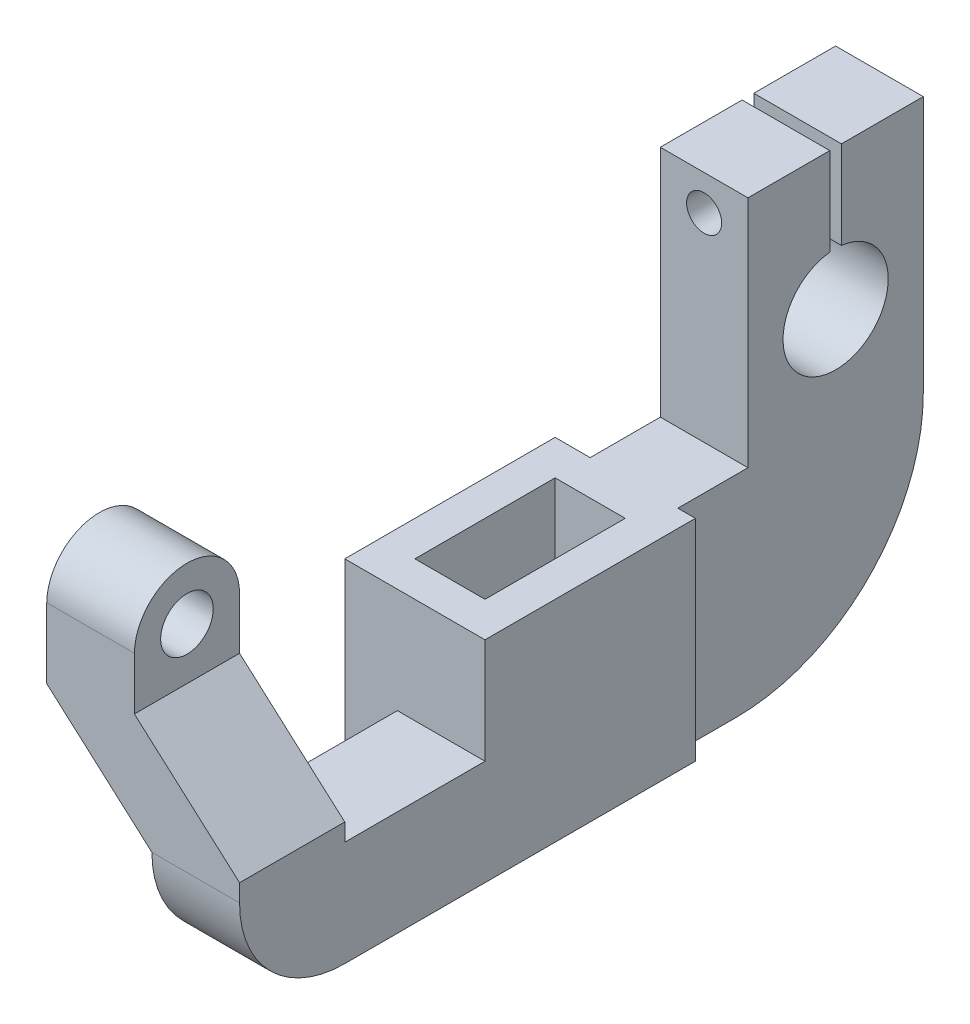
ISO-10303-21;
HEADER;
FILE_DESCRIPTION(('STEP AP214'),'2;1');
FILE_NAME('part.step','',(''),(''),'','','');
FILE_SCHEMA(('AUTOMOTIVE_DESIGN { 1 0 10303 214 1 1 1 1 }'));
ENDSEC;
DATA;
#1=APPLICATION_CONTEXT('core data for automotive mechanical design processes');
#2=APPLICATION_PROTOCOL_DEFINITION('international standard','automotive_design',2000,#1);
#3=PRODUCT_CONTEXT('',#1,'mechanical');
#4=PRODUCT('Part','Part','',(#3));
#5=PRODUCT_RELATED_PRODUCT_CATEGORY('part','',(#4));
#6=PRODUCT_DEFINITION_FORMATION('','',#4);
#7=PRODUCT_DEFINITION_CONTEXT('part definition',#1,'design');
#8=PRODUCT_DEFINITION('design','',#6,#7);
#9=PRODUCT_DEFINITION_SHAPE('','',#8);
#10=(LENGTH_UNIT() NAMED_UNIT(*) SI_UNIT(.MILLI.,.METRE.));
#11=(NAMED_UNIT(*) PLANE_ANGLE_UNIT() SI_UNIT($,.RADIAN.));
#12=(NAMED_UNIT(*) SI_UNIT($,.STERADIAN.) SOLID_ANGLE_UNIT());
#13=UNCERTAINTY_MEASURE_WITH_UNIT(LENGTH_MEASURE(1.E-05),#10,'distance_accuracy_value','');
#14=(GEOMETRIC_REPRESENTATION_CONTEXT(3) GLOBAL_UNCERTAINTY_ASSIGNED_CONTEXT((#13)) GLOBAL_UNIT_ASSIGNED_CONTEXT((#10,
#11,#12)) REPRESENTATION_CONTEXT('',''));
#15=CARTESIAN_POINT('',(0.,0.,0.));
#16=DIRECTION('',(0.,0.,1.));
#17=DIRECTION('',(1.,0.,0.));
#18=AXIS2_PLACEMENT_3D('',#15,#16,#17);
#19=CARTESIAN_POINT('',(-33.,-30.1388436180788,81.));
#20=DIRECTION('',(1.,0.,0.));
#21=DIRECTION('',(0.,0.,-1.));
#22=AXIS2_PLACEMENT_3D('',#19,#20,#21);
#23=CYLINDRICAL_SURFACE('',#22,9.00107091130168);
#24=DIRECTION('',(1.,0.,0.));
#25=VECTOR('',#24,1.);
#26=CARTESIAN_POINT('',(-33.,-30.,90.));
#27=LINE('',#26,#25);
#28=CARTESIAN_POINT('',(-33.,-30.,90.));
#29=VERTEX_POINT('',#28);
#30=CARTESIAN_POINT('',(-18.,-30.0000000000014,90.));
#31=VERTEX_POINT('',#30);
#32=EDGE_CURVE('E432',#29,#31,#27,.T.);
#33=ORIENTED_EDGE('',*,*,#32,.T.);
#34=CARTESIAN_POINT('',(-18.,-30.1388436180788,81.));
#35=DIRECTION('',(1.,0.,0.));
#36=DIRECTION('',(0.,0.,-1.));
#37=AXIS2_PLACEMENT_3D('',#34,#35,#36);
#38=CIRCLE('',#37,9.00107091130168);
#39=CARTESIAN_POINT('',(-18.,-30.,72.));
#40=VERTEX_POINT('',#39);
#41=EDGE_CURVE('E237',#31,#40,#38,.F.);
#42=ORIENTED_EDGE('',*,*,#41,.T.);
#43=DIRECTION('',(1.,0.,0.));
#44=VECTOR('',#43,1.);
#45=CARTESIAN_POINT('',(-33.,-30.,72.));
#46=LINE('',#45,#44);
#47=CARTESIAN_POINT('',(-33.,-30.,72.));
#48=VERTEX_POINT('',#47);
#49=EDGE_CURVE('E434',#48,#40,#46,.T.);
#50=ORIENTED_EDGE('',*,*,#49,.F.);
#51=CARTESIAN_POINT('',(-33.,-30.1388436180788,81.));
#52=DIRECTION('',(1.,0.,0.));
#53=DIRECTION('',(0.,0.,-1.));
#54=AXIS2_PLACEMENT_3D('',#51,#52,#53);
#55=CIRCLE('',#54,9.00107091130168);
#56=EDGE_CURVE('E391',#48,#29,#55,.T.);
#57=ORIENTED_EDGE('',*,*,#56,.T.);
#58=EDGE_LOOP('',(#33,#42,#50,#57));
#59=FACE_BOUND('',#58,.T.);
#60=ADVANCED_FACE('F39',(#59),#23,.T.);
#61=CARTESIAN_POINT('',(-33.,-30.1388436180788,81.));
#62=DIRECTION('',(1.,0.,0.));
#63=DIRECTION('',(0.,0.,-1.));
#64=AXIS2_PLACEMENT_3D('',#61,#62,#63);
#65=CYLINDRICAL_SURFACE('',#64,4.5);
#66=CARTESIAN_POINT('',(-33.,-30.1388436180788,81.));
#67=DIRECTION('',(1.,0.,0.));
#68=DIRECTION('',(0.,0.,-1.));
#69=AXIS2_PLACEMENT_3D('',#66,#67,#68);
#70=CIRCLE('',#69,4.5);
#71=CARTESIAN_POINT('',(-33.,-30.1388436180788,76.5));
#72=VERTEX_POINT('',#71);
#73=EDGE_CURVE('E373',#72,#72,#70,.T.);
#74=ORIENTED_EDGE('',*,*,#73,.F.);
#75=EDGE_LOOP('',(#74));
#76=FACE_BOUND('',#75,.T.);
#77=CARTESIAN_POINT('',(-18.,-30.1388436180788,81.));
#78=DIRECTION('',(1.,0.,0.));
#79=DIRECTION('',(0.,0.,-1.));
#80=AXIS2_PLACEMENT_3D('',#77,#78,#79);
#81=CIRCLE('',#80,4.5);
#82=CARTESIAN_POINT('',(-18.,-30.1388436180788,76.5));
#83=VERTEX_POINT('',#82);
#84=EDGE_CURVE('E43',#83,#83,#81,.F.);
#85=ORIENTED_EDGE('',*,*,#84,.F.);
#86=EDGE_LOOP('',(#85));
#87=FACE_BOUND('',#86,.T.);
#88=ADVANCED_FACE('F556',(#76,#87),#65,.F.);
#89=CARTESIAN_POINT('',(-33.,-58.,72.));
#90=DIRECTION('',(1.,0.,0.));
#91=DIRECTION('',(0.,0.,-1.));
#92=AXIS2_PLACEMENT_3D('',#89,#90,#91);
#93=CYLINDRICAL_SURFACE('',#92,18.);
#94=DIRECTION('',(1.,0.,0.));
#95=VECTOR('',#94,1.);
#96=CARTESIAN_POINT('',(-33.,-58.,90.));
#97=LINE('',#96,#95);
#98=CARTESIAN_POINT('',(-15.,-58.,90.));
#99=VERTEX_POINT('',#98);
#100=CARTESIAN_POINT('',(0.,-58.,90.));
#101=VERTEX_POINT('',#100);
#102=EDGE_CURVE('E430',#99,#101,#97,.T.);
#103=ORIENTED_EDGE('',*,*,#102,.F.);
#104=CARTESIAN_POINT('',(-15.,-58.,72.));
#105=DIRECTION('',(-1.,0.,0.));
#106=DIRECTION('',(0.,-1.,0.));
#107=AXIS2_PLACEMENT_3D('',#104,#105,#106);
#108=CIRCLE('',#107,18.);
#109=CARTESIAN_POINT('',(-15.,-76.,72.));
#110=VERTEX_POINT('',#109);
#111=EDGE_CURVE('E260',#99,#110,#108,.F.);
#112=ORIENTED_EDGE('',*,*,#111,.T.);
#113=DIRECTION('',(1.,0.,0.));
#114=VECTOR('',#113,1.);
#115=CARTESIAN_POINT('',(-33.,-76.,72.));
#116=LINE('',#115,#114);
#117=CARTESIAN_POINT('',(0.,-76.,72.));
#118=VERTEX_POINT('',#117);
#119=EDGE_CURVE('E427',#110,#118,#116,.T.);
#120=ORIENTED_EDGE('',*,*,#119,.T.);
#121=CARTESIAN_POINT('',(0.,-58.,72.));
#122=DIRECTION('',(1.,0.,0.));
#123=DIRECTION('',(0.,0.,-1.));
#124=AXIS2_PLACEMENT_3D('',#121,#122,#123);
#125=CIRCLE('',#124,18.);
#126=EDGE_CURVE('E410',#101,#118,#125,.T.);
#127=ORIENTED_EDGE('',*,*,#126,.F.);
#128=EDGE_LOOP('',(#103,#112,#120,#127));
#129=FACE_BOUND('',#128,.T.);
#130=ADVANCED_FACE('F518',(#129),#93,.T.);
#131=CARTESIAN_POINT('',(-33.,-30.,90.));
#132=DIRECTION('',(0.,0.,1.));
#133=DIRECTION('',(1.,0.,0.));
#134=AXIS2_PLACEMENT_3D('',#131,#132,#133);
#135=PLANE('',#134);
#136=DIRECTION('',(0.74740931868366,-0.66436383882992,0.));
#137=VECTOR('',#136,1.);
#138=CARTESIAN_POINT('',(-27.3103448275862,-30.7241379310345,90.));
#139=LINE('',#138,#137);
#140=CARTESIAN_POINT('',(-18.,-39.,90.));
#141=VERTEX_POINT('',#140);
#142=CARTESIAN_POINT('',(0.,-55.,90.));
#143=VERTEX_POINT('',#142);
#144=EDGE_CURVE('E55',#141,#143,#139,.T.);
#145=ORIENTED_EDGE('',*,*,#144,.F.);
#146=DIRECTION('',(0.,1.,0.));
#147=VECTOR('',#146,1.);
#148=CARTESIAN_POINT('',(-18.,0.,90.));
#149=LINE('',#148,#147);
#150=EDGE_CURVE('E233',#141,#31,#149,.T.);
#151=ORIENTED_EDGE('',*,*,#150,.T.);
#152=ORIENTED_EDGE('',*,*,#32,.F.);
#153=DIRECTION('',(0.,-1.,0.));
#154=VECTOR('',#153,1.);
#155=CARTESIAN_POINT('',(-33.,-30.,90.));
#156=LINE('',#155,#154);
#157=CARTESIAN_POINT('',(-33.,-42.,90.));
#158=VERTEX_POINT('',#157);
#159=EDGE_CURVE('E395',#29,#158,#156,.T.);
#160=ORIENTED_EDGE('',*,*,#159,.T.);
#161=DIRECTION('',(0.74740931868366,-0.66436383882992,0.));
#162=VECTOR('',#161,1.);
#163=CARTESIAN_POINT('',(-35.4206896551724,-39.848275862069,90.));
#164=LINE('',#163,#162);
#165=EDGE_CURVE('E63',#158,#99,#164,.T.);
#166=ORIENTED_EDGE('',*,*,#165,.T.);
#167=ORIENTED_EDGE('',*,*,#102,.T.);
#168=DIRECTION('',(0.,-1.,0.));
#169=VECTOR('',#168,1.);
#170=CARTESIAN_POINT('',(0.,-30.,90.));
#171=LINE('',#170,#169);
#172=EDGE_CURVE('E244',#143,#101,#171,.T.);
#173=ORIENTED_EDGE('',*,*,#172,.F.);
#174=EDGE_LOOP('',(#145,#151,#152,#160,#166,#167,#173));
#175=FACE_BOUND('',#174,.T.);
#176=ADVANCED_FACE('F242',(#175),#135,.T.);
#177=CARTESIAN_POINT('',(-33.,-58.,72.));
#178=DIRECTION('',(0.,0.,-1.));
#179=DIRECTION('',(-1.,0.,0.));
#180=AXIS2_PLACEMENT_3D('',#177,#178,#179);
#181=PLANE('',#180);
#182=DIRECTION('',(-0.74740931868366,0.664363838829919,0.));
#183=VECTOR('',#182,1.);
#184=CARTESIAN_POINT('',(-16.9448275862069,-39.9379310344828,72.));
#185=LINE('',#184,#183);
#186=CARTESIAN_POINT('',(0.,-55.,72.));
#187=VERTEX_POINT('',#186);
#188=CARTESIAN_POINT('',(-18.,-39.,72.));
#189=VERTEX_POINT('',#188);
#190=EDGE_CURVE('E227',#187,#189,#185,.T.);
#191=ORIENTED_EDGE('',*,*,#190,.F.);
#192=DIRECTION('',(0.,1.,0.));
#193=VECTOR('',#192,1.);
#194=CARTESIAN_POINT('',(0.,-58.,72.));
#195=LINE('',#194,#193);
#196=CARTESIAN_POINT('',(0.,-58.,72.));
#197=VERTEX_POINT('',#196);
#198=EDGE_CURVE('E406',#197,#187,#195,.T.);
#199=ORIENTED_EDGE('',*,*,#198,.F.);
#200=DIRECTION('',(1.,0.,0.));
#201=VECTOR('',#200,1.);
#202=CARTESIAN_POINT('',(-33.,-58.,72.));
#203=LINE('',#202,#201);
#204=CARTESIAN_POINT('',(-15.,-58.,72.));
#205=VERTEX_POINT('',#204);
#206=EDGE_CURVE('E437',#205,#197,#203,.T.);
#207=ORIENTED_EDGE('',*,*,#206,.F.);
#208=DIRECTION('',(-0.74740931868366,0.66436383882992,0.));
#209=VECTOR('',#208,1.);
#210=CARTESIAN_POINT('',(-25.0551724137931,-49.0620689655173,72.));
#211=LINE('',#210,#209);
#212=CARTESIAN_POINT('',(-33.,-42.,72.));
#213=VERTEX_POINT('',#212);
#214=EDGE_CURVE('E256',#205,#213,#211,.T.);
#215=ORIENTED_EDGE('',*,*,#214,.T.);
#216=DIRECTION('',(0.,1.,0.));
#217=VECTOR('',#216,1.);
#218=CARTESIAN_POINT('',(-33.,-58.,72.));
#219=LINE('',#218,#217);
#220=EDGE_CURVE('E389',#213,#48,#219,.T.);
#221=ORIENTED_EDGE('',*,*,#220,.T.);
#222=ORIENTED_EDGE('',*,*,#49,.T.);
#223=DIRECTION('',(0.,-1.,0.));
#224=VECTOR('',#223,1.);
#225=CARTESIAN_POINT('',(-18.,-58.,72.));
#226=LINE('',#225,#224);
#227=EDGE_CURVE('E249',#40,#189,#226,.T.);
#228=ORIENTED_EDGE('',*,*,#227,.T.);
#229=EDGE_LOOP('',(#191,#199,#207,#215,#221,#222,#228));
#230=FACE_BOUND('',#229,.T.);
#231=ADVANCED_FACE('F535',(#230),#181,.T.);
#232=CARTESIAN_POINT('',(-33.,-30.1388436180788,81.));
#233=DIRECTION('',(1.,0.,0.));
#234=DIRECTION('',(0.,0.,-1.));
#235=AXIS2_PLACEMENT_3D('',#232,#233,#234);
#236=PLANE('',#235);
#237=ORIENTED_EDGE('',*,*,#73,.T.);
#238=EDGE_LOOP('',(#237));
#239=FACE_BOUND('',#238,.T.);
#240=DIRECTION('',(0.,0.,1.));
#241=VECTOR('',#240,1.);
#242=CARTESIAN_POINT('',(-33.,-42.,63.));
#243=LINE('',#242,#241);
#244=EDGE_CURVE('E254',#213,#158,#243,.T.);
#245=ORIENTED_EDGE('',*,*,#244,.T.);
#246=ORIENTED_EDGE('',*,*,#159,.F.);
#247=ORIENTED_EDGE('',*,*,#56,.F.);
#248=ORIENTED_EDGE('',*,*,#220,.F.);
#249=EDGE_LOOP('',(#245,#246,#247,#248));
#250=FACE_BOUND('',#249,.T.);
#251=ADVANCED_FACE('F541',(#239,#250),#236,.F.);
#252=CARTESIAN_POINT('',(-33.,-44.,1.99999999999999));
#253=DIRECTION('',(1.,0.,0.));
#254=DIRECTION('',(0.,0.,-1.));
#255=AXIS2_PLACEMENT_3D('',#252,#253,#254);
#256=CYLINDRICAL_SURFACE('',#255,32.);
#257=CARTESIAN_POINT('',(-3.,-44.,1.99999999999999));
#258=DIRECTION('',(1.,0.,0.));
#259=DIRECTION('',(0.,0.,-1.));
#260=AXIS2_PLACEMENT_3D('',#257,#258,#259);
#261=CIRCLE('',#260,32.);
#262=CARTESIAN_POINT('',(-3.,-76.,2.00000000000022));
#263=VERTEX_POINT('',#262);
#264=CARTESIAN_POINT('',(-3.,-43.9999999999998,-30.));
#265=VERTEX_POINT('',#264);
#266=EDGE_CURVE('E319',#263,#265,#261,.T.);
#267=ORIENTED_EDGE('',*,*,#266,.F.);
#268=DIRECTION('',(1.,0.,0.));
#269=VECTOR('',#268,1.);
#270=CARTESIAN_POINT('',(-33.,-76.,2.00000000000022));
#271=LINE('',#270,#269);
#272=CARTESIAN_POINT('',(-18.,-76.,2.00000000000022));
#273=VERTEX_POINT('',#272);
#274=EDGE_CURVE('E424',#273,#263,#271,.T.);
#275=ORIENTED_EDGE('',*,*,#274,.F.);
#276=CARTESIAN_POINT('',(-18.,-44.,1.99999999999999));
#277=DIRECTION('',(1.,0.,0.));
#278=DIRECTION('',(0.,0.,-1.));
#279=AXIS2_PLACEMENT_3D('',#276,#277,#278);
#280=CIRCLE('',#279,32.);
#281=CARTESIAN_POINT('',(-18.,-43.9999999999998,-30.));
#282=VERTEX_POINT('',#281);
#283=EDGE_CURVE('E357',#273,#282,#280,.T.);
#284=ORIENTED_EDGE('',*,*,#283,.T.);
#285=DIRECTION('',(1.,0.,0.));
#286=VECTOR('',#285,1.);
#287=CARTESIAN_POINT('',(-33.,-43.9999999999998,-30.));
#288=LINE('',#287,#286);
#289=EDGE_CURVE('E421',#282,#265,#288,.T.);
#290=ORIENTED_EDGE('',*,*,#289,.T.);
#291=EDGE_LOOP('',(#267,#275,#284,#290));
#292=FACE_BOUND('',#291,.T.);
#293=ADVANCED_FACE('F481',(#292),#256,.T.);
#294=CARTESIAN_POINT('',(-33.,-40.,0.));
#295=DIRECTION('',(0.,1.,0.));
#296=DIRECTION('',(0.,0.,1.));
#297=AXIS2_PLACEMENT_3D('',#294,#295,#296);
#298=PLANE('',#297);
#299=DIRECTION('',(0.,0.,1.));
#300=VECTOR('',#299,1.);
#301=CARTESIAN_POINT('',(-18.,-40.,0.));
#302=LINE('',#301,#300);
#303=CARTESIAN_POINT('',(-18.,-40.,18.));
#304=VERTEX_POINT('',#303);
#305=CARTESIAN_POINT('',(-18.,-40.,42.));
#306=VERTEX_POINT('',#305);
#307=EDGE_CURVE('E297',#304,#306,#302,.T.);
#308=ORIENTED_EDGE('',*,*,#307,.F.);
#309=DIRECTION('',(-1.,0.,0.));
#310=VECTOR('',#309,1.);
#311=CARTESIAN_POINT('',(-33.,-40.,18.));
#312=LINE('',#311,#310);
#313=CARTESIAN_POINT('',(-6.,-40.,18.));
#314=VERTEX_POINT('',#313);
#315=EDGE_CURVE('E295',#314,#304,#312,.T.);
#316=ORIENTED_EDGE('',*,*,#315,.F.);
#317=DIRECTION('',(0.,0.,-1.));
#318=VECTOR('',#317,1.);
#319=CARTESIAN_POINT('',(-6.,-40.,0.));
#320=LINE('',#319,#318);
#321=CARTESIAN_POINT('',(-6.,-40.,42.));
#322=VERTEX_POINT('',#321);
#323=EDGE_CURVE('E293',#322,#314,#320,.T.);
#324=ORIENTED_EDGE('',*,*,#323,.F.);
#325=DIRECTION('',(1.,0.,0.));
#326=VECTOR('',#325,1.);
#327=CARTESIAN_POINT('',(-33.,-40.,42.));
#328=LINE('',#327,#326);
#329=EDGE_CURVE('E284',#306,#322,#328,.T.);
#330=ORIENTED_EDGE('',*,*,#329,.F.);
#331=EDGE_LOOP('',(#308,#316,#324,#330));
#332=FACE_BOUND('',#331,.T.);
#333=DIRECTION('',(1.,0.,0.));
#334=VECTOR('',#333,1.);
#335=CARTESIAN_POINT('',(-33.,-40.,12.));
#336=LINE('',#335,#334);
#337=CARTESIAN_POINT('',(-3.,-40.,12.));
#338=VERTEX_POINT('',#337);
#339=CARTESIAN_POINT('',(0.,-40.,12.));
#340=VERTEX_POINT('',#339);
#341=EDGE_CURVE('E327',#338,#340,#336,.T.);
#342=ORIENTED_EDGE('',*,*,#341,.F.);
#343=DIRECTION('',(0.,0.,-1.));
#344=VECTOR('',#343,1.);
#345=CARTESIAN_POINT('',(-3.,-40.,0.));
#346=LINE('',#345,#344);
#347=CARTESIAN_POINT('',(-3.,-40.,0.));
#348=VERTEX_POINT('',#347);
#349=EDGE_CURVE('E324',#338,#348,#346,.T.);
#350=ORIENTED_EDGE('',*,*,#349,.T.);
#351=DIRECTION('',(1.,0.,0.));
#352=VECTOR('',#351,1.);
#353=CARTESIAN_POINT('',(-33.,-40.,0.));
#354=LINE('',#353,#352);
#355=CARTESIAN_POINT('',(-18.,-40.,0.));
#356=VERTEX_POINT('',#355);
#357=EDGE_CURVE('E398',#356,#348,#354,.T.);
#358=ORIENTED_EDGE('',*,*,#357,.F.);
#359=DIRECTION('',(0.,0.,-1.));
#360=VECTOR('',#359,1.);
#361=CARTESIAN_POINT('',(-18.,-40.,0.));
#362=LINE('',#361,#360);
#363=CARTESIAN_POINT('',(-18.,-40.,12.));
#364=VERTEX_POINT('',#363);
#365=EDGE_CURVE('E355',#364,#356,#362,.T.);
#366=ORIENTED_EDGE('',*,*,#365,.F.);
#367=DIRECTION('',(1.,0.,0.));
#368=VECTOR('',#367,1.);
#369=CARTESIAN_POINT('',(-33.,-40.,12.));
#370=LINE('',#369,#368);
#371=CARTESIAN_POINT('',(-24.,-40.,12.));
#372=VERTEX_POINT('',#371);
#373=EDGE_CURVE('E342',#372,#364,#370,.T.);
#374=ORIENTED_EDGE('',*,*,#373,.F.);
#375=DIRECTION('',(0.,0.,1.));
#376=VECTOR('',#375,1.);
#377=CARTESIAN_POINT('',(-24.,-40.,0.));
#378=LINE('',#377,#376);
#379=CARTESIAN_POINT('',(-24.,-40.,48.));
#380=VERTEX_POINT('',#379);
#381=EDGE_CURVE('E417',#372,#380,#378,.T.);
#382=ORIENTED_EDGE('',*,*,#381,.T.);
#383=DIRECTION('',(1.,0.,0.));
#384=VECTOR('',#383,1.);
#385=CARTESIAN_POINT('',(-33.,-40.,48.));
#386=LINE('',#385,#384);
#387=CARTESIAN_POINT('',(0.,-40.,48.));
#388=VERTEX_POINT('',#387);
#389=EDGE_CURVE('E441',#380,#388,#386,.T.);
#390=ORIENTED_EDGE('',*,*,#389,.T.);
#391=DIRECTION('',(0.,0.,1.));
#392=VECTOR('',#391,1.);
#393=CARTESIAN_POINT('',(0.,-40.,0.));
#394=LINE('',#393,#392);
#395=EDGE_CURVE('E380',#340,#388,#394,.T.);
#396=ORIENTED_EDGE('',*,*,#395,.F.);
#397=EDGE_LOOP('',(#342,#350,#358,#366,#374,#382,#390,#396));
#398=FACE_BOUND('',#397,.T.);
#399=ADVANCED_FACE('F498',(#332,#398),#298,.T.);
#400=CARTESIAN_POINT('',(-33.,0.,0.));
#401=DIRECTION('',(0.,-1.,0.));
#402=DIRECTION('',(0.,0.,-1.));
#403=AXIS2_PLACEMENT_3D('',#400,#401,#402);
#404=PLANE('',#403);
#405=DIRECTION('',(0.,0.,-1.));
#406=VECTOR('',#405,1.);
#407=CARTESIAN_POINT('',(-3.,0.,0.));
#408=LINE('',#407,#406);
#409=CARTESIAN_POINT('',(-3.,0.,-16.));
#410=VERTEX_POINT('',#409);
#411=CARTESIAN_POINT('',(-3.,0.,-30.));
#412=VERTEX_POINT('',#411);
#413=EDGE_CURVE('E300',#410,#412,#408,.T.);
#414=ORIENTED_EDGE('',*,*,#413,.T.);
#415=DIRECTION('',(1.,0.,0.));
#416=VECTOR('',#415,1.);
#417=CARTESIAN_POINT('',(-33.,0.,-30.));
#418=LINE('',#417,#416);
#419=CARTESIAN_POINT('',(-18.,0.,-30.));
#420=VERTEX_POINT('',#419);
#421=EDGE_CURVE('E418',#420,#412,#418,.T.);
#422=ORIENTED_EDGE('',*,*,#421,.F.);
#423=DIRECTION('',(0.,0.,-1.));
#424=VECTOR('',#423,1.);
#425=CARTESIAN_POINT('',(-18.,0.,0.));
#426=LINE('',#425,#424);
#427=CARTESIAN_POINT('',(-18.,0.,-16.));
#428=VERTEX_POINT('',#427);
#429=EDGE_CURVE('E329',#428,#420,#426,.T.);
#430=ORIENTED_EDGE('',*,*,#429,.F.);
#431=DIRECTION('',(1.,0.,0.));
#432=VECTOR('',#431,1.);
#433=CARTESIAN_POINT('',(-33.,0.,-16.));
#434=LINE('',#433,#432);
#435=EDGE_CURVE('E381',#428,#410,#434,.T.);
#436=ORIENTED_EDGE('',*,*,#435,.T.);
#437=EDGE_LOOP('',(#414,#422,#430,#436));
#438=FACE_BOUND('',#437,.T.);
#439=ADVANCED_FACE('F473',(#438),#404,.F.);
#440=CARTESIAN_POINT('',(-33.,0.,0.));
#441=DIRECTION('',(0.,0.,1.));
#442=DIRECTION('',(0.,-1.,0.));
#443=AXIS2_PLACEMENT_3D('',#440,#441,#442);
#444=PLANE('',#443);
#445=CARTESIAN_POINT('',(-10.5,-6.,0.));
#446=DIRECTION('',(0.,0.,1.));
#447=DIRECTION('',(1.,0.,0.));
#448=AXIS2_PLACEMENT_3D('',#445,#446,#447);
#449=CIRCLE('',#448,3.);
#450=CARTESIAN_POINT('',(-7.5,-6.,0.));
#451=VERTEX_POINT('',#450);
#452=EDGE_CURVE('E262',#451,#451,#449,.T.);
#453=ORIENTED_EDGE('',*,*,#452,.F.);
#454=EDGE_LOOP('',(#453));
#455=FACE_BOUND('',#454,.T.);
#456=ORIENTED_EDGE('',*,*,#357,.T.);
#457=DIRECTION('',(0.,1.,0.));
#458=VECTOR('',#457,1.);
#459=CARTESIAN_POINT('',(-3.,0.,0.));
#460=LINE('',#459,#458);
#461=CARTESIAN_POINT('',(-3.,0.,0.));
#462=VERTEX_POINT('',#461);
#463=EDGE_CURVE('E321',#348,#462,#460,.T.);
#464=ORIENTED_EDGE('',*,*,#463,.T.);
#465=DIRECTION('',(1.,0.,0.));
#466=VECTOR('',#465,1.);
#467=CARTESIAN_POINT('',(-33.,0.,0.));
#468=LINE('',#467,#466);
#469=CARTESIAN_POINT('',(-18.,0.,0.));
#470=VERTEX_POINT('',#469);
#471=EDGE_CURVE('E414',#470,#462,#468,.T.);
#472=ORIENTED_EDGE('',*,*,#471,.F.);
#473=DIRECTION('',(0.,1.,0.));
#474=VECTOR('',#473,1.);
#475=CARTESIAN_POINT('',(-18.,0.,0.));
#476=LINE('',#475,#474);
#477=EDGE_CURVE('E353',#356,#470,#476,.T.);
#478=ORIENTED_EDGE('',*,*,#477,.F.);
#479=EDGE_LOOP('',(#456,#464,#472,#478));
#480=FACE_BOUND('',#479,.T.);
#481=ADVANCED_FACE('F41',(#455,#480),#444,.T.);
#482=CARTESIAN_POINT('',(-3.,0.,-14.));
#483=VERTEX_POINT('',#482);
#484=EDGE_CURVE('E303',#462,#483,#408,.T.);
#485=ORIENTED_EDGE('',*,*,#484,.T.);
#486=DIRECTION('',(1.,0.,0.));
#487=VECTOR('',#486,1.);
#488=CARTESIAN_POINT('',(-33.,0.,-14.));
#489=LINE('',#488,#487);
#490=CARTESIAN_POINT('',(-18.,0.,-14.));
#491=VERTEX_POINT('',#490);
#492=EDGE_CURVE('E377',#491,#483,#489,.T.);
#493=ORIENTED_EDGE('',*,*,#492,.F.);
#494=EDGE_CURVE('E331',#470,#491,#426,.T.);
#495=ORIENTED_EDGE('',*,*,#494,.F.);
#496=ORIENTED_EDGE('',*,*,#471,.T.);
#497=EDGE_LOOP('',(#485,#493,#495,#496));
#498=FACE_BOUND('',#497,.T.);
#499=ADVANCED_FACE('F578',(#498),#404,.F.);
#500=CARTESIAN_POINT('',(-33.,0.,-30.));
#501=DIRECTION('',(0.,0.,1.));
#502=DIRECTION('',(0.,-1.,0.));
#503=AXIS2_PLACEMENT_3D('',#500,#501,#502);
#504=PLANE('',#503);
#505=DIRECTION('',(0.,1.,0.));
#506=VECTOR('',#505,1.);
#507=CARTESIAN_POINT('',(-3.,0.,-30.));
#508=LINE('',#507,#506);
#509=EDGE_CURVE('E317',#265,#412,#508,.T.);
#510=ORIENTED_EDGE('',*,*,#509,.F.);
#511=ORIENTED_EDGE('',*,*,#289,.F.);
#512=DIRECTION('',(0.,1.,0.));
#513=VECTOR('',#512,1.);
#514=CARTESIAN_POINT('',(-18.,-76.,-30.));
#515=LINE('',#514,#513);
#516=EDGE_CURVE('E339',#282,#420,#515,.T.);
#517=ORIENTED_EDGE('',*,*,#516,.T.);
#518=ORIENTED_EDGE('',*,*,#421,.T.);
#519=EDGE_LOOP('',(#510,#511,#517,#518));
#520=FACE_BOUND('',#519,.T.);
#521=ADVANCED_FACE('F478',(#520),#504,.F.);
#522=CARTESIAN_POINT('',(-33.,-76.,2.00000000000022));
#523=DIRECTION('',(0.,1.,0.));
#524=DIRECTION('',(0.,0.,1.));
#525=AXIS2_PLACEMENT_3D('',#522,#523,#524);
#526=PLANE('',#525);
#527=DIRECTION('',(-1.,0.,0.));
#528=VECTOR('',#527,1.);
#529=CARTESIAN_POINT('',(-18.,-76.,18.));
#530=LINE('',#529,#528);
#531=CARTESIAN_POINT('',(-6.,-76.,18.));
#532=VERTEX_POINT('',#531);
#533=CARTESIAN_POINT('',(-18.,-76.,18.));
#534=VERTEX_POINT('',#533);
#535=EDGE_CURVE('E277',#532,#534,#530,.T.);
#536=ORIENTED_EDGE('',*,*,#535,.T.);
#537=DIRECTION('',(0.,0.,1.));
#538=VECTOR('',#537,1.);
#539=CARTESIAN_POINT('',(-18.,-76.0000000000001,42.));
#540=LINE('',#539,#538);
#541=CARTESIAN_POINT('',(-18.,-76.0000000000001,42.));
#542=VERTEX_POINT('',#541);
#543=EDGE_CURVE('E268',#534,#542,#540,.T.);
#544=ORIENTED_EDGE('',*,*,#543,.T.);
#545=DIRECTION('',(1.,0.,0.));
#546=VECTOR('',#545,1.);
#547=CARTESIAN_POINT('',(-18.,-76.0000000000001,42.));
#548=LINE('',#547,#546);
#549=CARTESIAN_POINT('',(-6.,-76.,42.));
#550=VERTEX_POINT('',#549);
#551=EDGE_CURVE('E271',#542,#550,#548,.T.);
#552=ORIENTED_EDGE('',*,*,#551,.T.);
#553=DIRECTION('',(0.,0.,-1.));
#554=VECTOR('',#553,1.);
#555=CARTESIAN_POINT('',(-6.,-76.0000000000001,42.));
#556=LINE('',#555,#554);
#557=EDGE_CURVE('E274',#550,#532,#556,.T.);
#558=ORIENTED_EDGE('',*,*,#557,.T.);
#559=EDGE_LOOP('',(#536,#544,#552,#558));
#560=FACE_BOUND('',#559,.T.);
#561=DIRECTION('',(0.,0.,-1.));
#562=VECTOR('',#561,1.);
#563=CARTESIAN_POINT('',(-3.,-76.,0.));
#564=LINE('',#563,#562);
#565=CARTESIAN_POINT('',(-3.,-76.,12.));
#566=VERTEX_POINT('',#565);
#567=EDGE_CURVE('E304',#566,#263,#564,.T.);
#568=ORIENTED_EDGE('',*,*,#567,.F.);
#569=DIRECTION('',(1.,0.,0.));
#570=VECTOR('',#569,1.);
#571=CARTESIAN_POINT('',(0.,-76.,12.));
#572=LINE('',#571,#570);
#573=CARTESIAN_POINT('',(0.,-76.,12.));
#574=VERTEX_POINT('',#573);
#575=EDGE_CURVE('E306',#566,#574,#572,.T.);
#576=ORIENTED_EDGE('',*,*,#575,.T.);
#577=DIRECTION('',(0.,0.,1.));
#578=VECTOR('',#577,1.);
#579=CARTESIAN_POINT('',(0.,-76.,2.00000000000022));
#580=LINE('',#579,#578);
#581=EDGE_CURVE('E392',#574,#118,#580,.T.);
#582=ORIENTED_EDGE('',*,*,#581,.T.);
#583=ORIENTED_EDGE('',*,*,#119,.F.);
#584=DIRECTION('',(0.,0.,-1.));
#585=VECTOR('',#584,1.);
#586=CARTESIAN_POINT('',(-15.,-76.,48.));
#587=LINE('',#586,#585);
#588=CARTESIAN_POINT('',(-15.,-76.,48.));
#589=VERTEX_POINT('',#588);
#590=EDGE_CURVE('E360',#110,#589,#587,.T.);
#591=ORIENTED_EDGE('',*,*,#590,.T.);
#592=DIRECTION('',(-1.,0.,0.));
#593=VECTOR('',#592,1.);
#594=CARTESIAN_POINT('',(-33.,-76.,48.));
#595=LINE('',#594,#593);
#596=CARTESIAN_POINT('',(-24.,-76.,48.));
#597=VERTEX_POINT('',#596);
#598=EDGE_CURVE('E362',#589,#597,#595,.T.);
#599=ORIENTED_EDGE('',*,*,#598,.T.);
#600=DIRECTION('',(0.,0.,1.));
#601=VECTOR('',#600,1.);
#602=CARTESIAN_POINT('',(-24.,-76.,0.));
#603=LINE('',#602,#601);
#604=CARTESIAN_POINT('',(-24.,-76.,12.));
#605=VERTEX_POINT('',#604);
#606=EDGE_CURVE('E368',#605,#597,#603,.T.);
#607=ORIENTED_EDGE('',*,*,#606,.F.);
#608=DIRECTION('',(1.,0.,0.));
#609=VECTOR('',#608,1.);
#610=CARTESIAN_POINT('',(0.,-76.,12.));
#611=LINE('',#610,#609);
#612=CARTESIAN_POINT('',(-18.,-76.,12.));
#613=VERTEX_POINT('',#612);
#614=EDGE_CURVE('E332',#605,#613,#611,.T.);
#615=ORIENTED_EDGE('',*,*,#614,.T.);
#616=DIRECTION('',(0.,0.,-1.));
#617=VECTOR('',#616,1.);
#618=CARTESIAN_POINT('',(-18.,-76.,0.));
#619=LINE('',#618,#617);
#620=EDGE_CURVE('E335',#613,#273,#619,.T.);
#621=ORIENTED_EDGE('',*,*,#620,.T.);
#622=ORIENTED_EDGE('',*,*,#274,.T.);
#623=EDGE_LOOP('',(#568,#576,#582,#583,#591,#599,#607,#615,#621,#622));
#624=FACE_BOUND('',#623,.T.);
#625=ADVANCED_FACE('F485',(#560,#624),#526,.F.);
#626=CARTESIAN_POINT('',(-33.,0.,-14.));
#627=DIRECTION('',(0.,0.,1.));
#628=DIRECTION('',(1.,0.,0.));
#629=AXIS2_PLACEMENT_3D('',#626,#627,#628);
#630=PLANE('',#629);
#631=CARTESIAN_POINT('',(-10.5,-6.,-14.));
#632=DIRECTION('',(0.,0.,1.));
#633=DIRECTION('',(1.,0.,0.));
#634=AXIS2_PLACEMENT_3D('',#631,#632,#633);
#635=CIRCLE('',#634,3.);
#636=CARTESIAN_POINT('',(-7.5,-6.,-14.));
#637=VERTEX_POINT('',#636);
#638=EDGE_CURVE('E265',#637,#637,#635,.F.);
#639=ORIENTED_EDGE('',*,*,#638,.F.);
#640=EDGE_LOOP('',(#639));
#641=FACE_BOUND('',#640,.T.);
#642=DIRECTION('',(0.,1.,0.));
#643=VECTOR('',#642,1.);
#644=CARTESIAN_POINT('',(-3.,0.,-14.));
#645=LINE('',#644,#643);
#646=CARTESIAN_POINT('',(-3.,-15.0557280900008,-14.));
#647=VERTEX_POINT('',#646);
#648=EDGE_CURVE('E315',#647,#483,#645,.T.);
#649=ORIENTED_EDGE('',*,*,#648,.F.);
#650=DIRECTION('',(1.,0.,0.));
#651=VECTOR('',#650,1.);
#652=CARTESIAN_POINT('',(-33.,-15.0557280900008,-14.));
#653=LINE('',#652,#651);
#654=CARTESIAN_POINT('',(-18.,-15.0557280900008,-14.));
#655=VERTEX_POINT('',#654);
#656=EDGE_CURVE('E376',#655,#647,#653,.T.);
#657=ORIENTED_EDGE('',*,*,#656,.F.);
#658=DIRECTION('',(0.,1.,0.));
#659=VECTOR('',#658,1.);
#660=CARTESIAN_POINT('',(-18.,0.,-14.));
#661=LINE('',#660,#659);
#662=EDGE_CURVE('E350',#655,#491,#661,.T.);
#663=ORIENTED_EDGE('',*,*,#662,.T.);
#664=ORIENTED_EDGE('',*,*,#492,.T.);
#665=EDGE_LOOP('',(#649,#657,#663,#664));
#666=FACE_BOUND('',#665,.T.);
#667=ADVANCED_FACE('F461',(#641,#666),#630,.F.);
#668=CARTESIAN_POINT('',(-33.,0.,-16.));
#669=DIRECTION('',(0.,0.,1.));
#670=DIRECTION('',(1.,0.,0.));
#671=AXIS2_PLACEMENT_3D('',#668,#669,#670);
#672=PLANE('',#671);
#673=DIRECTION('',(1.,0.,0.));
#674=VECTOR('',#673,1.);
#675=CARTESIAN_POINT('',(-33.,-15.0557280900008,-16.));
#676=LINE('',#675,#674);
#677=CARTESIAN_POINT('',(-18.,-15.0557280900008,-16.));
#678=VERTEX_POINT('',#677);
#679=CARTESIAN_POINT('',(-3.,-15.0557280900008,-16.));
#680=VERTEX_POINT('',#679);
#681=EDGE_CURVE('E384',#678,#680,#676,.T.);
#682=ORIENTED_EDGE('',*,*,#681,.T.);
#683=DIRECTION('',(0.,1.,0.));
#684=VECTOR('',#683,1.);
#685=CARTESIAN_POINT('',(-3.,0.,-16.));
#686=LINE('',#685,#684);
#687=EDGE_CURVE('E312',#680,#410,#686,.T.);
#688=ORIENTED_EDGE('',*,*,#687,.T.);
#689=ORIENTED_EDGE('',*,*,#435,.F.);
#690=DIRECTION('',(0.,1.,0.));
#691=VECTOR('',#690,1.);
#692=CARTESIAN_POINT('',(-18.,0.,-16.));
#693=LINE('',#692,#691);
#694=EDGE_CURVE('E348',#678,#428,#693,.T.);
#695=ORIENTED_EDGE('',*,*,#694,.F.);
#696=EDGE_LOOP('',(#682,#688,#689,#695));
#697=FACE_BOUND('',#696,.T.);
#698=ADVANCED_FACE('F471',(#697),#672,.T.);
#699=CARTESIAN_POINT('',(-33.,-24.,-15.));
#700=DIRECTION('',(1.,0.,0.));
#701=DIRECTION('',(0.,0.,-1.));
#702=AXIS2_PLACEMENT_3D('',#699,#700,#701);
#703=CYLINDRICAL_SURFACE('',#702,9.00000000000001);
#704=CARTESIAN_POINT('',(-3.,-24.,-15.));
#705=DIRECTION('',(1.,0.,0.));
#706=DIRECTION('',(0.,0.,-1.));
#707=AXIS2_PLACEMENT_3D('',#704,#705,#706);
#708=CIRCLE('',#707,9.00000000000001);
#709=EDGE_CURVE('E48',#680,#647,#708,.F.);
#710=ORIENTED_EDGE('',*,*,#709,.F.);
#711=ORIENTED_EDGE('',*,*,#681,.F.);
#712=CARTESIAN_POINT('',(-18.,-24.,-15.));
#713=DIRECTION('',(1.,0.,0.));
#714=DIRECTION('',(0.,0.,-1.));
#715=AXIS2_PLACEMENT_3D('',#712,#713,#714);
#716=CIRCLE('',#715,9.00000000000001);
#717=EDGE_CURVE('E449',#678,#655,#716,.F.);
#718=ORIENTED_EDGE('',*,*,#717,.T.);
#719=ORIENTED_EDGE('',*,*,#656,.T.);
#720=EDGE_LOOP('',(#710,#711,#718,#719));
#721=FACE_BOUND('',#720,.T.);
#722=ADVANCED_FACE('F463',(#721),#703,.F.);
#723=CARTESIAN_POINT('',(-33.,-40.,48.));
#724=DIRECTION('',(0.,0.,1.));
#725=DIRECTION('',(1.,0.,0.));
#726=AXIS2_PLACEMENT_3D('',#723,#724,#725);
#727=PLANE('',#726);
#728=DIRECTION('',(0.,-1.,0.));
#729=VECTOR('',#728,1.);
#730=CARTESIAN_POINT('',(0.,-40.,48.));
#731=LINE('',#730,#729);
#732=CARTESIAN_POINT('',(0.,-58.,48.));
#733=VERTEX_POINT('',#732);
#734=EDGE_CURVE('E400',#388,#733,#731,.T.);
#735=ORIENTED_EDGE('',*,*,#734,.F.);
#736=ORIENTED_EDGE('',*,*,#389,.F.);
#737=DIRECTION('',(0.,1.,0.));
#738=VECTOR('',#737,1.);
#739=CARTESIAN_POINT('',(-24.,-76.,48.));
#740=LINE('',#739,#738);
#741=EDGE_CURVE('E370',#597,#380,#740,.T.);
#742=ORIENTED_EDGE('',*,*,#741,.F.);
#743=ORIENTED_EDGE('',*,*,#598,.F.);
#744=DIRECTION('',(0.,1.,0.));
#745=VECTOR('',#744,1.);
#746=CARTESIAN_POINT('',(-15.,-76.,48.));
#747=LINE('',#746,#745);
#748=CARTESIAN_POINT('',(-15.,-58.,48.));
#749=VERTEX_POINT('',#748);
#750=EDGE_CURVE('E365',#589,#749,#747,.T.);
#751=ORIENTED_EDGE('',*,*,#750,.T.);
#752=DIRECTION('',(1.,0.,0.));
#753=VECTOR('',#752,1.);
#754=CARTESIAN_POINT('',(-33.,-58.,48.));
#755=LINE('',#754,#753);
#756=EDGE_CURVE('E439',#749,#733,#755,.T.);
#757=ORIENTED_EDGE('',*,*,#756,.T.);
#758=EDGE_LOOP('',(#735,#736,#742,#743,#751,#757));
#759=FACE_BOUND('',#758,.T.);
#760=ADVANCED_FACE('F528',(#759),#727,.T.);
#761=CARTESIAN_POINT('',(-33.,-58.,48.));
#762=DIRECTION('',(0.,1.,0.));
#763=DIRECTION('',(0.,0.,1.));
#764=AXIS2_PLACEMENT_3D('',#761,#762,#763);
#765=PLANE('',#764);
#766=DIRECTION('',(0.,0.,-1.));
#767=VECTOR('',#766,1.);
#768=CARTESIAN_POINT('',(-15.,-58.,48.));
#769=LINE('',#768,#767);
#770=EDGE_CURVE('E447',#205,#749,#769,.T.);
#771=ORIENTED_EDGE('',*,*,#770,.F.);
#772=ORIENTED_EDGE('',*,*,#206,.T.);
#773=DIRECTION('',(0.,0.,1.));
#774=VECTOR('',#773,1.);
#775=CARTESIAN_POINT('',(0.,-58.,48.));
#776=LINE('',#775,#774);
#777=EDGE_CURVE('E403',#733,#197,#776,.T.);
#778=ORIENTED_EDGE('',*,*,#777,.F.);
#779=ORIENTED_EDGE('',*,*,#756,.F.);
#780=EDGE_LOOP('',(#771,#772,#778,#779));
#781=FACE_BOUND('',#780,.T.);
#782=ADVANCED_FACE('F532',(#781),#765,.T.);
#783=CARTESIAN_POINT('',(0.,-30.1388436180788,81.));
#784=DIRECTION('',(1.,0.,0.));
#785=DIRECTION('',(0.,0.,-1.));
#786=AXIS2_PLACEMENT_3D('',#783,#784,#785);
#787=PLANE('',#786);
#788=DIRECTION('',(0.,0.,1.));
#789=VECTOR('',#788,1.);
#790=CARTESIAN_POINT('',(0.,-55.,63.));
#791=LINE('',#790,#789);
#792=EDGE_CURVE('E230',#187,#143,#791,.T.);
#793=ORIENTED_EDGE('',*,*,#792,.T.);
#794=ORIENTED_EDGE('',*,*,#172,.T.);
#795=ORIENTED_EDGE('',*,*,#126,.T.);
#796=ORIENTED_EDGE('',*,*,#581,.F.);
#797=DIRECTION('',(0.,-1.,0.));
#798=VECTOR('',#797,1.);
#799=CARTESIAN_POINT('',(0.,-30.1388436180788,12.));
#800=LINE('',#799,#798);
#801=EDGE_CURVE('E11',#340,#574,#800,.T.);
#802=ORIENTED_EDGE('',*,*,#801,.F.);
#803=ORIENTED_EDGE('',*,*,#395,.T.);
#804=ORIENTED_EDGE('',*,*,#734,.T.);
#805=ORIENTED_EDGE('',*,*,#777,.T.);
#806=ORIENTED_EDGE('',*,*,#198,.T.);
#807=EDGE_LOOP('',(#793,#794,#795,#796,#802,#803,#804,#805,#806));
#808=FACE_BOUND('',#807,.T.);
#809=ADVANCED_FACE('F514',(#808),#787,.T.);
#810=CARTESIAN_POINT('',(-24.,-76.,0.));
#811=DIRECTION('',(-1.,0.,0.));
#812=DIRECTION('',(0.,0.,1.));
#813=AXIS2_PLACEMENT_3D('',#810,#811,#812);
#814=PLANE('',#813);
#815=DIRECTION('',(0.,1.,0.));
#816=VECTOR('',#815,1.);
#817=CARTESIAN_POINT('',(-24.,-76.,12.));
#818=LINE('',#817,#816);
#819=EDGE_CURVE('E338',#605,#372,#818,.T.);
#820=ORIENTED_EDGE('',*,*,#819,.F.);
#821=ORIENTED_EDGE('',*,*,#606,.T.);
#822=ORIENTED_EDGE('',*,*,#741,.T.);
#823=ORIENTED_EDGE('',*,*,#381,.F.);
#824=EDGE_LOOP('',(#820,#821,#822,#823));
#825=FACE_BOUND('',#824,.T.);
#826=ADVANCED_FACE('F493',(#825),#814,.T.);
#827=CARTESIAN_POINT('',(-15.,-76.,48.));
#828=DIRECTION('',(1.,0.,0.));
#829=DIRECTION('',(0.,0.,-1.));
#830=AXIS2_PLACEMENT_3D('',#827,#828,#829);
#831=PLANE('',#830);
#832=ORIENTED_EDGE('',*,*,#770,.T.);
#833=ORIENTED_EDGE('',*,*,#750,.F.);
#834=ORIENTED_EDGE('',*,*,#590,.F.);
#835=ORIENTED_EDGE('',*,*,#111,.F.);
#836=DIRECTION('',(0.,0.,1.));
#837=VECTOR('',#836,1.);
#838=CARTESIAN_POINT('',(-15.,-58.,63.));
#839=LINE('',#838,#837);
#840=EDGE_CURVE('E253',#205,#99,#839,.T.);
#841=ORIENTED_EDGE('',*,*,#840,.F.);
#842=EDGE_LOOP('',(#832,#833,#834,#835,#841));
#843=FACE_BOUND('',#842,.T.);
#844=ADVANCED_FACE('F523',(#843),#831,.F.);
#845=CARTESIAN_POINT('',(-18.,-76.,0.));
#846=DIRECTION('',(1.,0.,0.));
#847=DIRECTION('',(0.,0.,-1.));
#848=AXIS2_PLACEMENT_3D('',#845,#846,#847);
#849=PLANE('',#848);
#850=ORIENTED_EDGE('',*,*,#620,.F.);
#851=DIRECTION('',(0.,1.,0.));
#852=VECTOR('',#851,1.);
#853=CARTESIAN_POINT('',(-18.,-76.,12.));
#854=LINE('',#853,#852);
#855=EDGE_CURVE('E343',#613,#364,#854,.T.);
#856=ORIENTED_EDGE('',*,*,#855,.T.);
#857=ORIENTED_EDGE('',*,*,#365,.T.);
#858=ORIENTED_EDGE('',*,*,#477,.T.);
#859=ORIENTED_EDGE('',*,*,#494,.T.);
#860=ORIENTED_EDGE('',*,*,#662,.F.);
#861=ORIENTED_EDGE('',*,*,#717,.F.);
#862=ORIENTED_EDGE('',*,*,#694,.T.);
#863=ORIENTED_EDGE('',*,*,#429,.T.);
#864=ORIENTED_EDGE('',*,*,#516,.F.);
#865=ORIENTED_EDGE('',*,*,#283,.F.);
#866=EDGE_LOOP('',(#850,#856,#857,#858,#859,#860,#861,#862,#863,#864,#865));
#867=FACE_BOUND('',#866,.T.);
#868=ADVANCED_FACE('F467',(#867),#849,.F.);
#869=CARTESIAN_POINT('',(0.,-76.,12.));
#870=DIRECTION('',(0.,0.,1.));
#871=DIRECTION('',(0.,-1.,0.));
#872=AXIS2_PLACEMENT_3D('',#869,#870,#871);
#873=PLANE('',#872);
#874=ORIENTED_EDGE('',*,*,#373,.T.);
#875=ORIENTED_EDGE('',*,*,#855,.F.);
#876=ORIENTED_EDGE('',*,*,#614,.F.);
#877=ORIENTED_EDGE('',*,*,#819,.T.);
#878=EDGE_LOOP('',(#874,#875,#876,#877));
#879=FACE_BOUND('',#878,.T.);
#880=ADVANCED_FACE('F489',(#879),#873,.F.);
#881=CARTESIAN_POINT('',(-3.,-76.,0.));
#882=DIRECTION('',(1.,0.,0.));
#883=DIRECTION('',(0.,0.,-1.));
#884=AXIS2_PLACEMENT_3D('',#881,#882,#883);
#885=PLANE('',#884);
#886=DIRECTION('',(0.,1.,0.));
#887=VECTOR('',#886,1.);
#888=CARTESIAN_POINT('',(-3.,-76.,12.));
#889=LINE('',#888,#887);
#890=EDGE_CURVE('E309',#566,#338,#889,.T.);
#891=ORIENTED_EDGE('',*,*,#890,.F.);
#892=ORIENTED_EDGE('',*,*,#567,.T.);
#893=ORIENTED_EDGE('',*,*,#266,.T.);
#894=ORIENTED_EDGE('',*,*,#509,.T.);
#895=ORIENTED_EDGE('',*,*,#413,.F.);
#896=ORIENTED_EDGE('',*,*,#687,.F.);
#897=ORIENTED_EDGE('',*,*,#709,.T.);
#898=ORIENTED_EDGE('',*,*,#648,.T.);
#899=ORIENTED_EDGE('',*,*,#484,.F.);
#900=ORIENTED_EDGE('',*,*,#463,.F.);
#901=ORIENTED_EDGE('',*,*,#349,.F.);
#902=EDGE_LOOP('',(#891,#892,#893,#894,#895,#896,#897,#898,#899,#900,#901));
#903=FACE_BOUND('',#902,.T.);
#904=ADVANCED_FACE('F455',(#903),#885,.T.);
#905=CARTESIAN_POINT('',(0.,-76.,12.));
#906=DIRECTION('',(0.,0.,1.));
#907=DIRECTION('',(0.,-1.,0.));
#908=AXIS2_PLACEMENT_3D('',#905,#906,#907);
#909=PLANE('',#908);
#910=ORIENTED_EDGE('',*,*,#341,.T.);
#911=ORIENTED_EDGE('',*,*,#801,.T.);
#912=ORIENTED_EDGE('',*,*,#575,.F.);
#913=ORIENTED_EDGE('',*,*,#890,.T.);
#914=EDGE_LOOP('',(#910,#911,#912,#913));
#915=FACE_BOUND('',#914,.T.);
#916=ADVANCED_FACE('F509',(#915),#909,.F.);
#917=CARTESIAN_POINT('',(-18.,-76.0000000000001,42.));
#918=DIRECTION('',(-1.,0.,0.));
#919=DIRECTION('',(0.,0.,1.));
#920=AXIS2_PLACEMENT_3D('',#917,#918,#919);
#921=PLANE('',#920);
#922=ORIENTED_EDGE('',*,*,#307,.T.);
#923=DIRECTION('',(0.,1.,0.));
#924=VECTOR('',#923,1.);
#925=CARTESIAN_POINT('',(-18.,-76.0000000000001,42.));
#926=LINE('',#925,#924);
#927=EDGE_CURVE('E280',#542,#306,#926,.T.);
#928=ORIENTED_EDGE('',*,*,#927,.F.);
#929=ORIENTED_EDGE('',*,*,#543,.F.);
#930=DIRECTION('',(0.,1.,0.));
#931=VECTOR('',#930,1.);
#932=CARTESIAN_POINT('',(-18.,-76.,18.));
#933=LINE('',#932,#931);
#934=EDGE_CURVE('E281',#534,#304,#933,.T.);
#935=ORIENTED_EDGE('',*,*,#934,.T.);
#936=EDGE_LOOP('',(#922,#928,#929,#935));
#937=FACE_BOUND('',#936,.T.);
#938=ADVANCED_FACE('F585',(#937),#921,.F.);
#939=CARTESIAN_POINT('',(-18.,-76.,18.));
#940=DIRECTION('',(0.,0.,-1.));
#941=DIRECTION('',(0.,1.,0.));
#942=AXIS2_PLACEMENT_3D('',#939,#940,#941);
#943=PLANE('',#942);
#944=ORIENTED_EDGE('',*,*,#315,.T.);
#945=ORIENTED_EDGE('',*,*,#934,.F.);
#946=ORIENTED_EDGE('',*,*,#535,.F.);
#947=DIRECTION('',(0.,1.,0.));
#948=VECTOR('',#947,1.);
#949=CARTESIAN_POINT('',(-6.,-76.,18.));
#950=LINE('',#949,#948);
#951=EDGE_CURVE('E285',#532,#314,#950,.T.);
#952=ORIENTED_EDGE('',*,*,#951,.T.);
#953=EDGE_LOOP('',(#944,#945,#946,#952));
#954=FACE_BOUND('',#953,.T.);
#955=ADVANCED_FACE('F590',(#954),#943,.F.);
#956=CARTESIAN_POINT('',(-6.,-76.0000000000001,42.));
#957=DIRECTION('',(1.,0.,0.));
#958=DIRECTION('',(0.,0.,-1.));
#959=AXIS2_PLACEMENT_3D('',#956,#957,#958);
#960=PLANE('',#959);
#961=ORIENTED_EDGE('',*,*,#323,.T.);
#962=ORIENTED_EDGE('',*,*,#951,.F.);
#963=ORIENTED_EDGE('',*,*,#557,.F.);
#964=DIRECTION('',(0.,1.,0.));
#965=VECTOR('',#964,1.);
#966=CARTESIAN_POINT('',(-6.,-76.0000000000001,42.));
#967=LINE('',#966,#965);
#968=EDGE_CURVE('E288',#550,#322,#967,.T.);
#969=ORIENTED_EDGE('',*,*,#968,.T.);
#970=EDGE_LOOP('',(#961,#962,#963,#969));
#971=FACE_BOUND('',#970,.T.);
#972=ADVANCED_FACE('F592',(#971),#960,.F.);
#973=CARTESIAN_POINT('',(-18.,-76.0000000000001,42.));
#974=DIRECTION('',(0.,0.,1.));
#975=DIRECTION('',(0.,-1.,0.));
#976=AXIS2_PLACEMENT_3D('',#973,#974,#975);
#977=PLANE('',#976);
#978=ORIENTED_EDGE('',*,*,#329,.T.);
#979=ORIENTED_EDGE('',*,*,#968,.F.);
#980=ORIENTED_EDGE('',*,*,#551,.F.);
#981=ORIENTED_EDGE('',*,*,#927,.T.);
#982=EDGE_LOOP('',(#978,#979,#980,#981));
#983=FACE_BOUND('',#982,.T.);
#984=ADVANCED_FACE('F552',(#983),#977,.F.);
#985=CARTESIAN_POINT('',(-10.5,-6.,-30.001));
#986=DIRECTION('',(0.,0.,1.));
#987=DIRECTION('',(1.,0.,0.));
#988=AXIS2_PLACEMENT_3D('',#985,#986,#987);
#989=CYLINDRICAL_SURFACE('',#988,3.);
#990=CARTESIAN_POINT('',(-7.5,-6.,0.));
#991=CARTESIAN_POINT('',(-7.5,-6.,-0.145833333333333));
#992=CARTESIAN_POINT('',(-7.5,-6.,-0.291666666666667));
#993=CARTESIAN_POINT('',(-7.5,-6.,-0.583333333333334));
#994=CARTESIAN_POINT('',(-7.5,-6.,-0.729166666666667));
#995=CARTESIAN_POINT('',(-7.5,-6.,-1.02083333333333));
#996=CARTESIAN_POINT('',(-7.5,-6.,-1.16666666666667));
#997=CARTESIAN_POINT('',(-7.5,-6.,-1.45833333333333));
#998=CARTESIAN_POINT('',(-7.5,-6.,-1.60416666666667));
#999=CARTESIAN_POINT('',(-7.5,-6.,-1.89583333333333));
#1000=CARTESIAN_POINT('',(-7.5,-6.,-2.04166666666667));
#1001=CARTESIAN_POINT('',(-7.5,-6.,-2.33333333333333));
#1002=CARTESIAN_POINT('',(-7.5,-6.,-2.47916666666667));
#1003=CARTESIAN_POINT('',(-7.5,-6.,-2.77083333333333));
#1004=CARTESIAN_POINT('',(-7.5,-6.,-2.91666666666667));
#1005=CARTESIAN_POINT('',(-7.5,-6.,-3.20833333333333));
#1006=CARTESIAN_POINT('',(-7.5,-6.,-3.35416666666667));
#1007=CARTESIAN_POINT('',(-7.5,-6.,-3.64583333333333));
#1008=CARTESIAN_POINT('',(-7.5,-6.,-3.79166666666667));
#1009=CARTESIAN_POINT('',(-7.5,-6.,-4.08333333333333));
#1010=CARTESIAN_POINT('',(-7.5,-6.,-4.22916666666667));
#1011=CARTESIAN_POINT('',(-7.5,-6.,-4.52083333333333));
#1012=CARTESIAN_POINT('',(-7.5,-6.,-4.66666666666667));
#1013=CARTESIAN_POINT('',(-7.5,-6.,-4.95833333333333));
#1014=CARTESIAN_POINT('',(-7.5,-6.,-5.10416666666666));
#1015=CARTESIAN_POINT('',(-7.5,-6.,-5.39583333333333));
#1016=CARTESIAN_POINT('',(-7.5,-6.,-5.54166666666666));
#1017=CARTESIAN_POINT('',(-7.5,-6.,-5.83333333333333));
#1018=CARTESIAN_POINT('',(-7.5,-6.,-5.97916666666667));
#1019=CARTESIAN_POINT('',(-7.5,-6.,-6.27083333333333));
#1020=CARTESIAN_POINT('',(-7.5,-6.,-6.41666666666667));
#1021=CARTESIAN_POINT('',(-7.5,-6.,-6.70833333333333));
#1022=CARTESIAN_POINT('',(-7.5,-6.,-6.85416666666667));
#1023=CARTESIAN_POINT('',(-7.5,-6.,-7.14583333333333));
#1024=CARTESIAN_POINT('',(-7.5,-6.,-7.29166666666667));
#1025=CARTESIAN_POINT('',(-7.5,-6.,-7.58333333333333));
#1026=CARTESIAN_POINT('',(-7.5,-6.,-7.72916666666667));
#1027=CARTESIAN_POINT('',(-7.5,-6.,-8.02083333333333));
#1028=CARTESIAN_POINT('',(-7.5,-6.,-8.16666666666667));
#1029=CARTESIAN_POINT('',(-7.5,-6.,-8.45833333333333));
#1030=CARTESIAN_POINT('',(-7.5,-6.,-8.60416666666667));
#1031=CARTESIAN_POINT('',(-7.5,-6.,-8.89583333333333));
#1032=CARTESIAN_POINT('',(-7.5,-6.,-9.04166666666667));
#1033=CARTESIAN_POINT('',(-7.5,-6.,-9.33333333333333));
#1034=CARTESIAN_POINT('',(-7.5,-6.,-9.47916666666667));
#1035=CARTESIAN_POINT('',(-7.5,-6.,-9.77083333333333));
#1036=CARTESIAN_POINT('',(-7.5,-6.,-9.91666666666667));
#1037=CARTESIAN_POINT('',(-7.5,-6.,-10.2083333333333));
#1038=CARTESIAN_POINT('',(-7.5,-6.,-10.3541666666667));
#1039=CARTESIAN_POINT('',(-7.5,-6.,-10.6458333333333));
#1040=CARTESIAN_POINT('',(-7.5,-6.,-10.7916666666667));
#1041=CARTESIAN_POINT('',(-7.5,-6.,-11.0833333333333));
#1042=CARTESIAN_POINT('',(-7.5,-6.,-11.2291666666667));
#1043=CARTESIAN_POINT('',(-7.5,-6.,-11.5208333333333));
#1044=CARTESIAN_POINT('',(-7.5,-6.,-11.6666666666667));
#1045=CARTESIAN_POINT('',(-7.5,-6.,-11.9583333333333));
#1046=CARTESIAN_POINT('',(-7.5,-6.,-12.1041666666667));
#1047=CARTESIAN_POINT('',(-7.5,-6.,-12.3958333333333));
#1048=CARTESIAN_POINT('',(-7.5,-6.,-12.5416666666667));
#1049=CARTESIAN_POINT('',(-7.5,-6.,-12.8333333333333));
#1050=CARTESIAN_POINT('',(-7.5,-6.,-12.9791666666667));
#1051=CARTESIAN_POINT('',(-7.5,-6.,-13.2708333333333));
#1052=CARTESIAN_POINT('',(-7.5,-6.,-13.4166666666667));
#1053=CARTESIAN_POINT('',(-7.5,-6.,-13.7083333333333));
#1054=CARTESIAN_POINT('',(-7.5,-6.,-13.8541666666667));
#1055=CARTESIAN_POINT('',(-7.5,-6.,-14.));
#1056=B_SPLINE_CURVE_WITH_KNOTS('',3,(#990,#991,#992,#993,#994,#995,#996,#997,#998,#999,#1000,
#1001,#1002,#1003,#1004,#1005,#1006,#1007,#1008,#1009,#1010,#1011,#1012,#1013,#1014,#1015,#1016,
#1017,#1018,#1019,#1020,#1021,#1022,#1023,#1024,#1025,#1026,#1027,#1028,#1029,#1030,#1031,#1032,
#1033,#1034,#1035,#1036,#1037,#1038,#1039,#1040,#1041,#1042,#1043,#1044,#1045,#1046,#1047,#1048,
#1049,#1050,#1051,#1052,#1053,#1054,#1055),.UNSPECIFIED.,.F.,.F.,(4,2,2,2,2,2,2,2,2,2,2,2,2,2,2,
2,2,2,2,2,2,2,2,2,2,2,2,2,2,2,2,2,4),(0.,0.4375,0.875000000000001,1.3125,1.75,2.1875,2.625,
3.0625,3.5,3.9375,4.375,4.8125,5.25,5.6875,6.125,6.5625,7.,7.4375,7.875,8.3125,8.75,9.1875,
9.625,10.0625,10.5,10.9375,11.375,11.8125,12.25,12.6875,13.125,13.5625,14.),.UNSPECIFIED.);
#1057=EDGE_CURVE('BSEAM545',#451,#637,#1056,.T.);
#1058=ORIENTED_EDGE('',*,*,#452,.T.);
#1059=ORIENTED_EDGE('',*,*,#638,.T.);
#1060=ORIENTED_EDGE('',*,*,#1057,.T.);
#1061=ORIENTED_EDGE('',*,*,#1057,.F.);
#1062=EDGE_LOOP('',(#1058,#1060,#1059,#1061));
#1063=FACE_BOUND('',#1062,.T.);
#1064=ADVANCED_FACE('F545',(#1063),#989,.F.);
#1065=CARTESIAN_POINT('',(-35.4206896551724,-39.848275862069,63.));
#1066=DIRECTION('',(-0.66436383882992,-0.74740931868366,0.));
#1067=DIRECTION('',(0.74740931868366,-0.66436383882992,0.));
#1068=AXIS2_PLACEMENT_3D('',#1065,#1066,#1067);
#1069=PLANE('',#1068);
#1070=ORIENTED_EDGE('',*,*,#840,.T.);
#1071=ORIENTED_EDGE('',*,*,#165,.F.);
#1072=ORIENTED_EDGE('',*,*,#244,.F.);
#1073=ORIENTED_EDGE('',*,*,#214,.F.);
#1074=EDGE_LOOP('',(#1070,#1071,#1072,#1073));
#1075=FACE_BOUND('',#1074,.T.);
#1076=ADVANCED_FACE('F543',(#1075),#1069,.T.);
#1077=CARTESIAN_POINT('',(-18.,0.,63.));
#1078=DIRECTION('',(1.,0.,0.));
#1079=DIRECTION('',(0.,0.,-1.));
#1080=AXIS2_PLACEMENT_3D('',#1077,#1078,#1079);
#1081=PLANE('',#1080);
#1082=ORIENTED_EDGE('',*,*,#41,.F.);
#1083=ORIENTED_EDGE('',*,*,#150,.F.);
#1084=DIRECTION('',(0.,0.,1.));
#1085=VECTOR('',#1084,1.);
#1086=CARTESIAN_POINT('',(-18.,-39.,63.));
#1087=LINE('',#1086,#1085);
#1088=EDGE_CURVE('E223',#189,#141,#1087,.T.);
#1089=ORIENTED_EDGE('',*,*,#1088,.F.);
#1090=ORIENTED_EDGE('',*,*,#227,.F.);
#1091=EDGE_LOOP('',(#1082,#1083,#1089,#1090));
#1092=FACE_BOUND('',#1091,.T.);
#1093=ORIENTED_EDGE('',*,*,#84,.T.);
#1094=EDGE_LOOP('',(#1093));
#1095=FACE_BOUND('',#1094,.T.);
#1096=ADVANCED_FACE('F234',(#1092,#1095),#1081,.T.);
#1097=CARTESIAN_POINT('',(-27.3103448275862,-30.7241379310345,63.));
#1098=DIRECTION('',(-0.664363838829919,-0.74740931868366,0.));
#1099=DIRECTION('',(0.74740931868366,-0.664363838829919,0.));
#1100=AXIS2_PLACEMENT_3D('',#1097,#1098,#1099);
#1101=PLANE('',#1100);
#1102=ORIENTED_EDGE('',*,*,#190,.T.);
#1103=ORIENTED_EDGE('',*,*,#1088,.T.);
#1104=ORIENTED_EDGE('',*,*,#144,.T.);
#1105=ORIENTED_EDGE('',*,*,#792,.F.);
#1106=EDGE_LOOP('',(#1102,#1103,#1104,#1105));
#1107=FACE_BOUND('',#1106,.T.);
#1108=ADVANCED_FACE('F225',(#1107),#1101,.F.);
#1109=CLOSED_SHELL('',(#60,#88,#130,#176,#231,#251,#293,#399,#439,#481,#499,#521,#625,#667,#698,
#722,#760,#782,#809,#826,#844,#868,#880,#904,#916,#938,#955,#972,#984,#1064,#1076,#1096,#1108));
#1110=MANIFOLD_SOLID_BREP('B2',#1109);
#1111=ADVANCED_BREP_SHAPE_REPRESENTATION('',(#18,#1110),#14);
#1112=SHAPE_DEFINITION_REPRESENTATION(#9,#1111);
ENDSEC;
END-ISO-10303-21;
